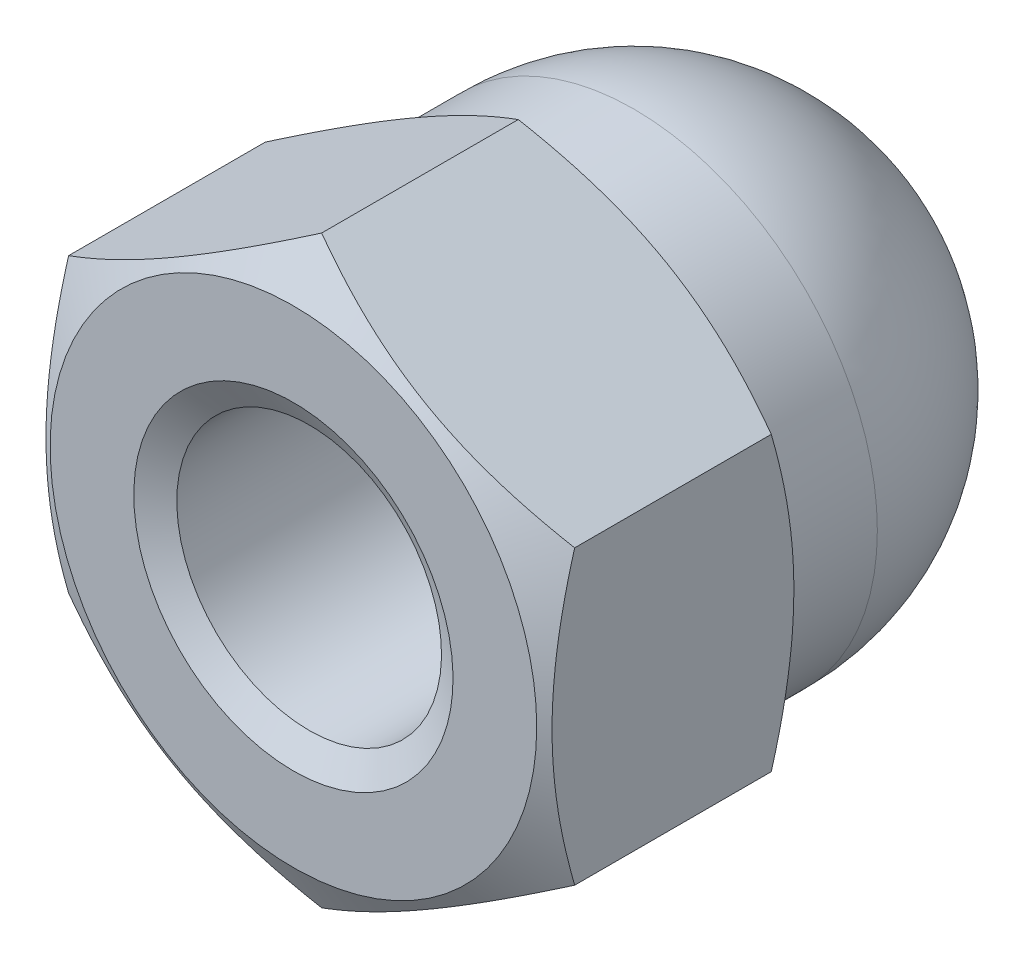
ISO-10303-21;
HEADER;
FILE_DESCRIPTION(('STEP AP214'),'2;1');
FILE_NAME('part.step','',(''),(''),'','','');
FILE_SCHEMA(('AUTOMOTIVE_DESIGN { 1 0 10303 214 1 1 1 1 }'));
ENDSEC;
DATA;
#1=APPLICATION_CONTEXT('core data for automotive mechanical design processes');
#2=APPLICATION_PROTOCOL_DEFINITION('international standard','automotive_design',2000,#1);
#3=PRODUCT_CONTEXT('',#1,'mechanical');
#4=PRODUCT('Part','Part','',(#3));
#5=PRODUCT_RELATED_PRODUCT_CATEGORY('part','',(#4));
#6=PRODUCT_DEFINITION_FORMATION('','',#4);
#7=PRODUCT_DEFINITION_CONTEXT('part definition',#1,'design');
#8=PRODUCT_DEFINITION('design','',#6,#7);
#9=PRODUCT_DEFINITION_SHAPE('','',#8);
#10=(LENGTH_UNIT() NAMED_UNIT(*) SI_UNIT(.MILLI.,.METRE.));
#11=(NAMED_UNIT(*) PLANE_ANGLE_UNIT() SI_UNIT($,.RADIAN.));
#12=(NAMED_UNIT(*) SI_UNIT($,.STERADIAN.) SOLID_ANGLE_UNIT());
#13=UNCERTAINTY_MEASURE_WITH_UNIT(LENGTH_MEASURE(1.E-05),#10,'distance_accuracy_value','');
#14=(GEOMETRIC_REPRESENTATION_CONTEXT(3) GLOBAL_UNCERTAINTY_ASSIGNED_CONTEXT((#13)) GLOBAL_UNIT_ASSIGNED_CONTEXT((#10,
#11,#12)) REPRESENTATION_CONTEXT('',''));
#15=CARTESIAN_POINT('',(0.,0.,0.));
#16=DIRECTION('',(0.,0.,1.));
#17=DIRECTION('',(1.,0.,0.));
#18=AXIS2_PLACEMENT_3D('',#15,#16,#17);
#19=CARTESIAN_POINT('',(0.,0.,-8.75));
#20=DIRECTION('',(0.,0.,1.));
#21=DIRECTION('',(0.,1.,0.));
#22=AXIS2_PLACEMENT_3D('',#19,#20,#21);
#23=SPHERICAL_SURFACE('',#22,6.25);
#24=CARTESIAN_POINT('',(0.,0.,-15.));
#25=VERTEX_POINT('',#24);
#26=VERTEX_LOOP('',#25);
#27=FACE_BOUND('',#26,.T.);
#28=CARTESIAN_POINT('',(0.,0.,-8.75));
#29=DIRECTION('',(0.,0.,1.));
#30=DIRECTION('',(1.,0.,0.));
#31=AXIS2_PLACEMENT_3D('',#28,#29,#30);
#32=CIRCLE('',#31,6.25);
#33=CARTESIAN_POINT('',(6.25,0.,-8.75));
#34=VERTEX_POINT('',#33);
#35=EDGE_CURVE('E250',#34,#34,#32,.T.);
#36=ORIENTED_EDGE('',*,*,#35,.F.);
#37=EDGE_LOOP('',(#36));
#38=FACE_BOUND('',#37,.T.);
#39=ADVANCED_FACE('F40',(#27,#38),#23,.T.);
#40=CARTESIAN_POINT('',(0.,0.,0.));
#41=DIRECTION('',(0.,0.,1.));
#42=DIRECTION('',(1.,0.,0.));
#43=AXIS2_PLACEMENT_3D('',#40,#41,#42);
#44=CYLINDRICAL_SURFACE('',#43,6.25);
#45=ORIENTED_EDGE('',*,*,#35,.T.);
#46=EDGE_LOOP('',(#45));
#47=FACE_BOUND('',#46,.T.);
#48=CARTESIAN_POINT('',(0.,0.,-6.5));
#49=DIRECTION('',(0.,0.,1.));
#50=DIRECTION('',(1.,0.,0.));
#51=AXIS2_PLACEMENT_3D('',#48,#49,#50);
#52=CIRCLE('',#51,6.25);
#53=CARTESIAN_POINT('',(6.25,0.,-6.5));
#54=VERTEX_POINT('',#53);
#55=EDGE_CURVE('E257',#54,#54,#52,.T.);
#56=ORIENTED_EDGE('',*,*,#55,.F.);
#57=EDGE_LOOP('',(#56));
#58=FACE_BOUND('',#57,.T.);
#59=ADVANCED_FACE('F113',(#47,#58),#44,.T.);
#60=CARTESIAN_POINT('',(0.,0.,-5.77510584910183));
#61=DIRECTION('',(0.,0.,1.));
#62=DIRECTION('',(1.,0.,0.));
#63=AXIS2_PLACEMENT_3D('',#60,#61,#62);
#64=CONICAL_SURFACE('',#63,7.50555349946514,1.0471975511966);
#65=ORIENTED_EDGE('',*,*,#55,.T.);
#66=EDGE_LOOP('',(#65));
#67=FACE_BOUND('',#66,.T.);
#68=CARTESIAN_POINT('',(6.5,-9.9329111139939,-3.25490668212306));
#69=CARTESIAN_POINT('',(6.5,-9.64767955039306,-3.39266312218123));
#70=CARTESIAN_POINT('',(6.5,-9.3617713334094,-3.52904400270682));
#71=CARTESIAN_POINT('',(6.5,-8.78823564087501,-3.79826812963094));
#72=CARTESIAN_POINT('',(6.5,-8.50060787599526,-3.93111075893199));
#73=CARTESIAN_POINT('',(6.5,-7.92170346582779,-4.19317607593001));
#74=CARTESIAN_POINT('',(6.5,-7.63041534596978,-4.32237350815587));
#75=CARTESIAN_POINT('',(6.5,-7.04543753790205,-4.5751901267429));
#76=CARTESIAN_POINT('',(6.5,-6.75174797646854,-4.69880960535651));
#77=CARTESIAN_POINT('',(6.5,-6.15794764754984,-4.94041567436681));
#78=CARTESIAN_POINT('',(6.5,-5.85780209090144,-5.05831723211061));
#79=CARTESIAN_POINT('',(6.5,-5.25396342793668,-5.28483618655303));
#80=CARTESIAN_POINT('',(6.5,-4.95026993066041,-5.39345254890334));
#81=CARTESIAN_POINT('',(6.5,-4.33948377050501,-5.59846829958748));
#82=CARTESIAN_POINT('',(6.5,-4.03239997429356,-5.69489383758256));
#83=CARTESIAN_POINT('',(6.5,-3.41386453476732,-5.87238231884677));
#84=CARTESIAN_POINT('',(6.5,-3.10241431094498,-5.95345013587121));
#85=CARTESIAN_POINT('',(6.5,-2.47494029352131,-6.09628094206173));
#86=CARTESIAN_POINT('',(6.5,-2.15891506480611,-6.15803773005165));
#87=CARTESIAN_POINT('',(6.5,-1.52303274646518,-6.25805563902524));
#88=CARTESIAN_POINT('',(6.5,-1.20317564973265,-6.29631671642553));
#89=CARTESIAN_POINT('',(6.5,-0.722892860804675,-6.33363342159267));
#90=CARTESIAN_POINT('',(6.5,-0.563206443347277,-6.34272902235531));
#91=CARTESIAN_POINT('',(6.5,-0.243584804318439,-6.35415572292365));
#92=CARTESIAN_POINT('',(6.5,-0.0836495865185552,-6.35648692428988));
#93=CARTESIAN_POINT('',(6.5,0.236128769735205,-6.35432167663095));
#94=CARTESIAN_POINT('',(6.5,0.39597192142786,-6.34982712805691));
#95=CARTESIAN_POINT('',(6.5,0.715330785773326,-6.33412365838045));
#96=CARTESIAN_POINT('',(6.5,0.874846480355594,-6.32291437622014));
#97=CARTESIAN_POINT('',(6.5,1.26198993509599,-6.28779328680309));
#98=CARTESIAN_POINT('',(6.5,1.48931571071904,-6.26048778077121));
#99=CARTESIAN_POINT('',(6.5,1.94217299466153,-6.19376399429842));
#100=CARTESIAN_POINT('',(6.5,2.16770422901663,-6.15434389944442));
#101=CARTESIAN_POINT('',(6.5,2.84200611808104,-6.01989020814481));
#102=CARTESIAN_POINT('',(6.5,3.28760230765344,-5.9087534364401));
#103=CARTESIAN_POINT('',(6.5,3.95410051775721,-5.71728873517789));
#104=CARTESIAN_POINT('',(6.5,4.17848908923233,-5.64841043008936));
#105=CARTESIAN_POINT('',(6.5,4.62509856435044,-5.50382682081051));
#106=CARTESIAN_POINT('',(6.5,4.84731927125518,-5.42812090327103));
#107=CARTESIAN_POINT('',(6.5,5.28848357156532,-5.27150122140702));
#108=CARTESIAN_POINT('',(6.5,5.5074385880228,-5.1906193076524));
#109=CARTESIAN_POINT('',(6.5,5.94348794783134,-5.02419729743006));
#110=CARTESIAN_POINT('',(6.5,6.16058290820352,-4.93865882083369));
#111=CARTESIAN_POINT('',(6.5,6.37689512702086,-4.85122853225757));
#112=B_SPLINE_CURVE_WITH_KNOTS('',3,(#68,#69,#70,#71,#72,#73,#74,#75,#76,#77,#78,#79,#80,#81,
#82,#83,#84,#85,#86,#87,#88,#89,#90,#91,#92,#93,#94,#95,#96,#97,#98,#99,#100,#101,#102,#103,
#104,#105,#106,#107,#108,#109,#110,#111),.UNSPECIFIED.,.F.,.F.,(4,2,2,2,2,2,2,2,2,2,2,2,2,2,2,2,
2,2,2,2,2,4),(0.,0.950278588424249,1.90072184145585,2.8566391323511,3.81250628042664,
4.77980343869427,5.74720821148916,6.71250133597995,7.67748761074125,8.64278344534725,
9.60808107052473,10.0877950648644,10.5675018567522,11.0470751113439,11.5266741553803,
12.2131633142698,12.8997553394188,14.2755893174374,14.9797013551423,15.6838767089079,
16.3840723670879,17.0840259867149),.UNSPECIFIED.);
#113=CARTESIAN_POINT('',(6.5,-3.75277674973257,-5.77510584910183));
#114=VERTEX_POINT('',#113);
#115=CARTESIAN_POINT('',(6.5,3.75277674973257,-5.77510584910183));
#116=VERTEX_POINT('',#115);
#117=EDGE_CURVE('E140',#114,#116,#112,.T.);
#118=ORIENTED_EDGE('',*,*,#117,.F.);
#119=CARTESIAN_POINT('',(-0.000200000000002426,-7.50566896951897,-5.77503918089673));
#120=CARTESIAN_POINT('',(0.142677459058878,-7.4231786300702,-5.82265800962711));
#121=CARTESIAN_POINT('',(0.28608763453491,-7.34038072665458,-5.86811573209989));
#122=CARTESIAN_POINT('',(0.574072631317192,-7.17411251123976,-5.95411375067955));
#123=CARTESIAN_POINT('',(0.718647926571261,-7.09064192560665,-5.99465192547457));
#124=CARTESIAN_POINT('',(1.15468865052003,-6.83889369625719,-6.10809143157939));
#125=CARTESIAN_POINT('',(1.44787528284632,-6.66962231516081,-6.17261462557386));
#126=CARTESIAN_POINT('',(1.88662374554437,-6.41631077211555,-6.2482758491551));
#127=CARTESIAN_POINT('',(2.03087463649469,-6.33302748139454,-6.26982957624561));
#128=CARTESIAN_POINT('',(2.32002821713809,-6.16608458377293,-6.30597211809647));
#129=CARTESIAN_POINT('',(2.46493084809889,-6.08242501078143,-6.32056154824293));
#130=CARTESIAN_POINT('',(2.75498777942832,-5.91496056339806,-6.34240368019525));
#131=CARTESIAN_POINT('',(2.90014160605421,-5.8311559625217,-6.34966470838049));
#132=CARTESIAN_POINT('',(3.19057533697495,-5.66347396979287,-6.35670213012036));
#133=CARTESIAN_POINT('',(3.33585523723635,-5.5795965802691,-6.35647875489039));
#134=CARTESIAN_POINT('',(3.73387594242649,-5.34979921898453,-6.34557897418743));
#135=CARTESIAN_POINT('',(3.98648646102757,-5.20395446807007,-6.32728061483318));
#136=CARTESIAN_POINT('',(4.49002967823568,-4.91323365606636,-6.26925609124492));
#137=CARTESIAN_POINT('',(4.74096060593308,-4.76835861741226,-6.22951009416435));
#138=CARTESIAN_POINT('',(5.24551722064432,-4.47705272008732,-6.13015652950044));
#139=CARTESIAN_POINT('',(5.49907924143591,-4.33065861912703,-6.07012800706457));
#140=CARTESIAN_POINT('',(6.00242193575904,-4.04005357906494,-5.93388744019273));
#141=CARTESIAN_POINT('',(6.25220905555296,-3.89583891821182,-5.857707398539));
#142=CARTESIAN_POINT('',(6.5002,-3.75266127967873,-5.77503918089673));
#143=B_SPLINE_CURVE_WITH_KNOTS('',3,(#119,#120,#121,#122,#123,#124,#125,#126,#127,#128,#129,
#130,#131,#132,#133,#134,#135,#136,#137,#138,#139,#140,#141,#142),.UNSPECIFIED.,.F.,.F.,(4,2,2,
2,2,2,2,2,2,2,2,4),(0.,0.515105052395587,1.03043143507524,2.06322554824262,2.56697389547996,
3.07067772176454,3.57380860368928,4.0769239424252,4.9527935470566,5.82947446853466,
6.72559912449736,7.61996451221046),.UNSPECIFIED.);
#144=CARTESIAN_POINT('',(0.,-7.50555349946514,-5.77510584910183));
#145=VERTEX_POINT('',#144);
#146=EDGE_CURVE('E211',#145,#114,#143,.T.);
#147=ORIENTED_EDGE('',*,*,#146,.F.);
#148=CARTESIAN_POINT('',(-6.5002,-3.75266127967873,-5.77503918089673));
#149=CARTESIAN_POINT('',(-6.35732254094112,-3.8351516191275,-5.82265800962711));
#150=CARTESIAN_POINT('',(-6.21391236546509,-3.91794952254312,-5.86811573209989));
#151=CARTESIAN_POINT('',(-5.9259273686828,-4.08421773795795,-5.95411375067955));
#152=CARTESIAN_POINT('',(-5.78135207342874,-4.16768832359105,-5.99465192547457));
#153=CARTESIAN_POINT('',(-5.34531134947997,-4.41943655294051,-6.10809143157939));
#154=CARTESIAN_POINT('',(-5.05212471715368,-4.58870793403689,-6.17261462557385));
#155=CARTESIAN_POINT('',(-4.61337625445563,-4.84201947708215,-6.2482758491551));
#156=CARTESIAN_POINT('',(-4.46912536350531,-4.92530276780316,-6.26982957624561));
#157=CARTESIAN_POINT('',(-4.17997178286191,-5.09224566542477,-6.30597211809647));
#158=CARTESIAN_POINT('',(-4.03506915190111,-5.17590523841627,-6.32056154824293));
#159=CARTESIAN_POINT('',(-3.74501222057168,-5.34336968579964,-6.34240368019525));
#160=CARTESIAN_POINT('',(-3.59985839394579,-5.427174286676,-6.34966470838048));
#161=CARTESIAN_POINT('',(-3.30942466302505,-5.59485627940484,-6.35670213012036));
#162=CARTESIAN_POINT('',(-3.16414476276364,-5.6787336689286,-6.35647875489039));
#163=CARTESIAN_POINT('',(-2.76612405757351,-5.90853103021317,-6.34557897418743));
#164=CARTESIAN_POINT('',(-2.51351353897243,-6.05437578112763,-6.32728061483318));
#165=CARTESIAN_POINT('',(-2.00997032176432,-6.34509659313135,-6.26925609124492));
#166=CARTESIAN_POINT('',(-1.75903939406692,-6.48997163178544,-6.22951009416435));
#167=CARTESIAN_POINT('',(-1.25448277935568,-6.78127752911038,-6.13015652950044));
#168=CARTESIAN_POINT('',(-1.00092075856409,-6.92767163007067,-6.07012800706457));
#169=CARTESIAN_POINT('',(-0.497578064240958,-7.21827667013277,-5.93388744019273));
#170=CARTESIAN_POINT('',(-0.247790944447039,-7.36249133098589,-5.857707398539));
#171=CARTESIAN_POINT('',(0.000199999999996356,-7.50566896951897,-5.77503918089673));
#172=B_SPLINE_CURVE_WITH_KNOTS('',3,(#148,#149,#150,#151,#152,#153,#154,#155,#156,#157,#158,
#159,#160,#161,#162,#163,#164,#165,#166,#167,#168,#169,#170,#171),.UNSPECIFIED.,.F.,.F.,(4,2,2,
2,2,2,2,2,2,2,2,4),(0.,0.515105052395587,1.03043143507524,2.06322554824262,2.56697389547996,
3.07067772176453,3.57380860368928,4.0769239424252,4.9527935470566,5.82947446853466,
6.72559912449736,7.61996451221045),.UNSPECIFIED.);
#173=CARTESIAN_POINT('',(-6.5,-3.75277674973257,-5.77510584910183));
#174=VERTEX_POINT('',#173);
#175=EDGE_CURVE('E204',#174,#145,#172,.T.);
#176=ORIENTED_EDGE('',*,*,#175,.F.);
#177=CARTESIAN_POINT('',(-6.5,-9.9329111139939,-3.25490668212307));
#178=CARTESIAN_POINT('',(-6.5,-9.64767955039306,-3.39266312218123));
#179=CARTESIAN_POINT('',(-6.5,-9.3617713334094,-3.52904400270682));
#180=CARTESIAN_POINT('',(-6.5,-8.78823564087501,-3.79826812963094));
#181=CARTESIAN_POINT('',(-6.5,-8.50060787599526,-3.93111075893199));
#182=CARTESIAN_POINT('',(-6.5,-7.92170346582779,-4.19317607593001));
#183=CARTESIAN_POINT('',(-6.5,-7.63041534596978,-4.32237350815587));
#184=CARTESIAN_POINT('',(-6.5,-7.04543753790205,-4.5751901267429));
#185=CARTESIAN_POINT('',(-6.5,-6.75174797646855,-4.69880960535651));
#186=CARTESIAN_POINT('',(-6.5,-6.15794764754984,-4.94041567436681));
#187=CARTESIAN_POINT('',(-6.5,-5.85780209090144,-5.05831723211062));
#188=CARTESIAN_POINT('',(-6.5,-5.25396342793668,-5.28483618655303));
#189=CARTESIAN_POINT('',(-6.5,-4.95026993066041,-5.39345254890334));
#190=CARTESIAN_POINT('',(-6.5,-4.33948377050501,-5.59846829958748));
#191=CARTESIAN_POINT('',(-6.5,-4.03239997429356,-5.69489383758256));
#192=CARTESIAN_POINT('',(-6.5,-3.41386453476732,-5.87238231884678));
#193=CARTESIAN_POINT('',(-6.5,-3.10241431094498,-5.95345013587121));
#194=CARTESIAN_POINT('',(-6.5,-2.47494029352131,-6.09628094206174));
#195=CARTESIAN_POINT('',(-6.5,-2.1589150648061,-6.15803773005165));
#196=CARTESIAN_POINT('',(-6.5,-1.52303274646518,-6.25805563902524));
#197=CARTESIAN_POINT('',(-6.5,-1.20317564973265,-6.29631671642553));
#198=CARTESIAN_POINT('',(-6.5,-0.722892860804673,-6.33363342159267));
#199=CARTESIAN_POINT('',(-6.5,-0.563206443347274,-6.34272902235531));
#200=CARTESIAN_POINT('',(-6.5,-0.243584804318436,-6.35415572292365));
#201=CARTESIAN_POINT('',(-6.5,-0.0836495865185526,-6.35648692428988));
#202=CARTESIAN_POINT('',(-6.5,0.236128769735207,-6.35432167663095));
#203=CARTESIAN_POINT('',(-6.5,0.395971921427861,-6.34982712805691));
#204=CARTESIAN_POINT('',(-6.5,0.715330785773325,-6.33412365838045));
#205=CARTESIAN_POINT('',(-6.5,0.874846480355593,-6.32291437622014));
#206=CARTESIAN_POINT('',(-6.5,1.26198993509598,-6.28779328680309));
#207=CARTESIAN_POINT('',(-6.5,1.48931571071904,-6.26048778077121));
#208=CARTESIAN_POINT('',(-6.5,1.94217299466152,-6.19376399429842));
#209=CARTESIAN_POINT('',(-6.5,2.16770422901663,-6.15434389944442));
#210=CARTESIAN_POINT('',(-6.5,2.84200611808104,-6.01989020814481));
#211=CARTESIAN_POINT('',(-6.5,3.28760230765344,-5.90875343644009));
#212=CARTESIAN_POINT('',(-6.5,3.95410051775721,-5.71728873517789));
#213=CARTESIAN_POINT('',(-6.5,4.17848908923233,-5.64841043008936));
#214=CARTESIAN_POINT('',(-6.5,4.62509856435044,-5.50382682081051));
#215=CARTESIAN_POINT('',(-6.5,4.84731927125518,-5.42812090327103));
#216=CARTESIAN_POINT('',(-6.5,5.28848357156532,-5.27150122140702));
#217=CARTESIAN_POINT('',(-6.5,5.5074385880228,-5.1906193076524));
#218=CARTESIAN_POINT('',(-6.5,5.94348794783134,-5.02419729743006));
#219=CARTESIAN_POINT('',(-6.5,6.16058290820352,-4.93865882083369));
#220=CARTESIAN_POINT('',(-6.5,6.37689512702086,-4.85122853225757));
#221=B_SPLINE_CURVE_WITH_KNOTS('',3,(#177,#178,#179,#180,#181,#182,#183,#184,#185,#186,#187,
#188,#189,#190,#191,#192,#193,#194,#195,#196,#197,#198,#199,#200,#201,#202,#203,#204,#205,#206,
#207,#208,#209,#210,#211,#212,#213,#214,#215,#216,#217,#218,#219,#220),.UNSPECIFIED.,.F.,.F.,(4,
2,2,2,2,2,2,2,2,2,2,2,2,2,2,2,2,2,2,2,2,4),(0.,0.950278588424246,1.90072184145585,
2.8566391323511,3.81250628042663,4.77980343869427,5.74720821148915,6.71250133597995,
7.67748761074125,8.64278344534725,9.60808107052473,10.0877950648644,10.5675018567522,
11.0470751113439,11.5266741553803,12.2131633142698,12.8997553394188,14.2755893174374,
14.9797013551423,15.6838767089079,16.3840723670879,17.0840259867149),.UNSPECIFIED.);
#222=CARTESIAN_POINT('',(-6.5,3.75277674973257,-5.77510584910183));
#223=VERTEX_POINT('',#222);
#224=EDGE_CURVE('E58',#223,#174,#221,.F.);
#225=ORIENTED_EDGE('',*,*,#224,.F.);
#226=CARTESIAN_POINT('',(0.000199999999999833,7.50566896951897,-5.77503918089673));
#227=CARTESIAN_POINT('',(-0.142677459058881,7.4231786300702,-5.82265800962711));
#228=CARTESIAN_POINT('',(-0.286087634534913,7.34038072665458,-5.86811573209989));
#229=CARTESIAN_POINT('',(-0.574072631317194,7.17411251123976,-5.95411375067955));
#230=CARTESIAN_POINT('',(-0.718647926571263,7.09064192560665,-5.99465192547457));
#231=CARTESIAN_POINT('',(-1.15468865052003,6.83889369625719,-6.10809143157939));
#232=CARTESIAN_POINT('',(-1.44787528284632,6.66962231516081,-6.17261462557385));
#233=CARTESIAN_POINT('',(-1.88662374554437,6.41631077211555,-6.2482758491551));
#234=CARTESIAN_POINT('',(-2.03087463649469,6.33302748139454,-6.26982957624561));
#235=CARTESIAN_POINT('',(-2.32002821713809,6.16608458377293,-6.30597211809647));
#236=CARTESIAN_POINT('',(-2.46493084809889,6.08242501078143,-6.32056154824293));
#237=CARTESIAN_POINT('',(-2.75498777942832,5.91496056339807,-6.34240368019525));
#238=CARTESIAN_POINT('',(-2.90014160605421,5.8311559625217,-6.34966470838048));
#239=CARTESIAN_POINT('',(-3.19057533697495,5.66347396979287,-6.35670213012036));
#240=CARTESIAN_POINT('',(-3.33585523723636,5.5795965802691,-6.35647875489039));
#241=CARTESIAN_POINT('',(-3.73387594242649,5.34979921898453,-6.34557897418743));
#242=CARTESIAN_POINT('',(-3.98648646102757,5.20395446807007,-6.32728061483318));
#243=CARTESIAN_POINT('',(-4.49002967823568,4.91323365606636,-6.26925609124492));
#244=CARTESIAN_POINT('',(-4.74096060593308,4.76835861741226,-6.22951009416435));
#245=CARTESIAN_POINT('',(-5.24551722064432,4.47705272008732,-6.13015652950044));
#246=CARTESIAN_POINT('',(-5.49907924143591,4.33065861912703,-6.07012800706457));
#247=CARTESIAN_POINT('',(-6.00242193575904,4.04005357906494,-5.93388744019273));
#248=CARTESIAN_POINT('',(-6.25220905555296,3.89583891821182,-5.857707398539));
#249=CARTESIAN_POINT('',(-6.5002,3.75266127967873,-5.77503918089673));
#250=B_SPLINE_CURVE_WITH_KNOTS('',3,(#226,#227,#228,#229,#230,#231,#232,#233,#234,#235,#236,
#237,#238,#239,#240,#241,#242,#243,#244,#245,#246,#247,#248,#249),.UNSPECIFIED.,.F.,.F.,(4,2,2,
2,2,2,2,2,2,2,2,4),(0.,0.515105052395587,1.03043143507524,2.06322554824262,2.56697389547996,
3.07067772176454,3.57380860368928,4.0769239424252,4.9527935470566,5.82947446853466,
6.72559912449736,7.61996451221045),.UNSPECIFIED.);
#251=CARTESIAN_POINT('',(0.,7.50555349946514,-5.77510584910183));
#252=VERTEX_POINT('',#251);
#253=EDGE_CURVE('E247',#252,#223,#250,.T.);
#254=ORIENTED_EDGE('',*,*,#253,.F.);
#255=CARTESIAN_POINT('',(6.5002,3.75266127967873,-5.77503918089673));
#256=CARTESIAN_POINT('',(6.35732254094112,3.83515161912751,-5.82265800962711));
#257=CARTESIAN_POINT('',(6.21391236546508,3.91794952254312,-5.86811573209989));
#258=CARTESIAN_POINT('',(5.9259273686828,4.08421773795795,-5.95411375067955));
#259=CARTESIAN_POINT('',(5.78135207342873,4.16768832359106,-5.99465192547457));
#260=CARTESIAN_POINT('',(5.34531134947996,4.41943655294052,-6.10809143157939));
#261=CARTESIAN_POINT('',(5.05212471715368,4.5887079340369,-6.17261462557385));
#262=CARTESIAN_POINT('',(4.61337625445562,4.84201947708215,-6.2482758491551));
#263=CARTESIAN_POINT('',(4.46912536350531,4.92530276780316,-6.26982957624561));
#264=CARTESIAN_POINT('',(4.17997178286191,5.09224566542477,-6.30597211809647));
#265=CARTESIAN_POINT('',(4.03506915190111,5.17590523841628,-6.32056154824293));
#266=CARTESIAN_POINT('',(3.74501222057168,5.34336968579964,-6.34240368019525));
#267=CARTESIAN_POINT('',(3.59985839394579,5.427174286676,-6.34966470838048));
#268=CARTESIAN_POINT('',(3.30942466302505,5.59485627940484,-6.35670213012036));
#269=CARTESIAN_POINT('',(3.16414476276364,5.6787336689286,-6.35647875489039));
#270=CARTESIAN_POINT('',(2.7661240575735,5.90853103021317,-6.34557897418743));
#271=CARTESIAN_POINT('',(2.51351353897243,6.05437578112763,-6.32728061483318));
#272=CARTESIAN_POINT('',(2.00997032176432,6.34509659313135,-6.26925609124492));
#273=CARTESIAN_POINT('',(1.75903939406692,6.48997163178545,-6.22951009416435));
#274=CARTESIAN_POINT('',(1.25448277935568,6.78127752911039,-6.13015652950044));
#275=CARTESIAN_POINT('',(1.00092075856408,6.92767163007068,-6.07012800706457));
#276=CARTESIAN_POINT('',(0.497578064240954,7.21827667013277,-5.93388744019273));
#277=CARTESIAN_POINT('',(0.247790944447035,7.36249133098589,-5.857707398539));
#278=CARTESIAN_POINT('',(-0.000200000000000841,7.50566896951897,-5.77503918089673));
#279=B_SPLINE_CURVE_WITH_KNOTS('',3,(#255,#256,#257,#258,#259,#260,#261,#262,#263,#264,#265,
#266,#267,#268,#269,#270,#271,#272,#273,#274,#275,#276,#277,#278),.UNSPECIFIED.,.F.,.F.,(4,2,2,
2,2,2,2,2,2,2,2,4),(0.,0.515105052395587,1.03043143507524,2.06322554824262,2.56697389547996,
3.07067772176453,3.57380860368928,4.0769239424252,4.9527935470566,5.82947446853466,
6.72559912449736,7.61996451221045),.UNSPECIFIED.);
#280=EDGE_CURVE('E227',#116,#252,#279,.T.);
#281=ORIENTED_EDGE('',*,*,#280,.F.);
#282=EDGE_LOOP('',(#118,#147,#176,#225,#254,#281));
#283=FACE_BOUND('',#282,.T.);
#284=ADVANCED_FACE('F119',(#67,#283),#64,.T.);
#285=CARTESIAN_POINT('',(0.,7.50555349946514,-15.));
#286=DIRECTION('',(-0.5,0.866025403784439,0.));
#287=DIRECTION('',(-0.866025403784439,-0.5,0.));
#288=AXIS2_PLACEMENT_3D('',#285,#286,#287);
#289=PLANE('',#288);
#290=DIRECTION('',(0.,0.,1.));
#291=VECTOR('',#290,1.);
#292=CARTESIAN_POINT('',(0.,7.50555349946514,-15.));
#293=LINE('',#292,#291);
#294=CARTESIAN_POINT('',(0.,7.50555349946514,-0.724894150898164));
#295=VERTEX_POINT('',#294);
#296=EDGE_CURVE('E45',#252,#295,#293,.T.);
#297=ORIENTED_EDGE('',*,*,#296,.F.);
#298=ORIENTED_EDGE('',*,*,#253,.T.);
#299=DIRECTION('',(0.,0.,1.));
#300=VECTOR('',#299,1.);
#301=CARTESIAN_POINT('',(-6.5,3.75277674973257,-15.));
#302=LINE('',#301,#300);
#303=CARTESIAN_POINT('',(-6.5,3.75277674973257,-0.724894150898164));
#304=VERTEX_POINT('',#303);
#305=EDGE_CURVE('E243',#223,#304,#302,.T.);
#306=ORIENTED_EDGE('',*,*,#305,.T.);
#307=CARTESIAN_POINT('',(-6.5002,3.75266127967873,-0.724960819103268));
#308=CARTESIAN_POINT('',(-6.35732254094112,3.83515161912751,-0.677341990372886));
#309=CARTESIAN_POINT('',(-6.21391236546509,3.91794952254312,-0.631884267900107));
#310=CARTESIAN_POINT('',(-5.9259273686828,4.08421773795795,-0.545886249320447));
#311=CARTESIAN_POINT('',(-5.78135207342873,4.16768832359106,-0.505348074525427));
#312=CARTESIAN_POINT('',(-5.34531134947996,4.41943655294052,-0.391908568420611));
#313=CARTESIAN_POINT('',(-5.05212471715368,4.5887079340369,-0.327385374426142));
#314=CARTESIAN_POINT('',(-4.61337625445563,4.84201947708215,-0.251724150844896));
#315=CARTESIAN_POINT('',(-4.46912536350531,4.92530276780316,-0.230170423754392));
#316=CARTESIAN_POINT('',(-4.17997178286191,5.09224566542477,-0.194027881903524));
#317=CARTESIAN_POINT('',(-4.03506915190111,5.17590523841627,-0.179438451757072));
#318=CARTESIAN_POINT('',(-3.74501222057168,5.34336968579964,-0.157596319804752));
#319=CARTESIAN_POINT('',(-3.59985839394579,5.427174286676,-0.150335291619513));
#320=CARTESIAN_POINT('',(-3.30942466302505,5.59485627940484,-0.143297869879637));
#321=CARTESIAN_POINT('',(-3.16414476276364,5.6787336689286,-0.14352124510961));
#322=CARTESIAN_POINT('',(-2.76612405757351,5.90853103021317,-0.15442102581257));
#323=CARTESIAN_POINT('',(-2.51351353897243,6.05437578112763,-0.172719385166818));
#324=CARTESIAN_POINT('',(-2.00997032176432,6.34509659313135,-0.23074390875508));
#325=CARTESIAN_POINT('',(-1.75903939406692,6.48997163178545,-0.270489905835649));
#326=CARTESIAN_POINT('',(-1.25448277935568,6.78127752911039,-0.369843470499553));
#327=CARTESIAN_POINT('',(-1.00092075856409,6.92767163007068,-0.42987199293543));
#328=CARTESIAN_POINT('',(-0.497578064240955,7.21827667013277,-0.56611255980727));
#329=CARTESIAN_POINT('',(-0.247790944447036,7.36249133098589,-0.642292601460994));
#330=CARTESIAN_POINT('',(0.000200000000000163,7.50566896951897,-0.724960819103268));
#331=B_SPLINE_CURVE_WITH_KNOTS('',3,(#307,#308,#309,#310,#311,#312,#313,#314,#315,#316,#317,
#318,#319,#320,#321,#322,#323,#324,#325,#326,#327,#328,#329,#330),.UNSPECIFIED.,.F.,.F.,(4,2,2,
2,2,2,2,2,2,2,2,4),(0.,0.515105052395588,1.03043143507524,2.06322554824262,2.56697389547996,
3.07067772176453,3.57380860368927,4.0769239424252,4.9527935470566,5.82947446853466,
6.72559912449736,7.61996451221045),.UNSPECIFIED.);
#332=EDGE_CURVE('E175',#304,#295,#331,.T.);
#333=ORIENTED_EDGE('',*,*,#332,.T.);
#334=EDGE_LOOP('',(#297,#298,#306,#333));
#335=FACE_BOUND('',#334,.T.);
#336=ADVANCED_FACE('F246',(#335),#289,.T.);
#337=CARTESIAN_POINT('',(-6.5,3.75277674973257,-15.));
#338=DIRECTION('',(-1.,0.,0.));
#339=DIRECTION('',(0.,0.,1.));
#340=AXIS2_PLACEMENT_3D('',#337,#338,#339);
#341=PLANE('',#340);
#342=ORIENTED_EDGE('',*,*,#305,.F.);
#343=ORIENTED_EDGE('',*,*,#224,.T.);
#344=DIRECTION('',(0.,0.,1.));
#345=VECTOR('',#344,1.);
#346=CARTESIAN_POINT('',(-6.5,-3.75277674973257,-15.));
#347=LINE('',#346,#345);
#348=CARTESIAN_POINT('',(-6.5,-3.75277674973257,-0.724894150898164));
#349=VERTEX_POINT('',#348);
#350=EDGE_CURVE('E245',#174,#349,#347,.T.);
#351=ORIENTED_EDGE('',*,*,#350,.T.);
#352=CARTESIAN_POINT('',(-6.5,-9.9329111139939,-3.24509331787692));
#353=CARTESIAN_POINT('',(-6.5,-9.64767955039306,-3.10733687781875));
#354=CARTESIAN_POINT('',(-6.5,-9.3617713334094,-2.97095599729316));
#355=CARTESIAN_POINT('',(-6.5,-8.78823564087501,-2.70173187036905));
#356=CARTESIAN_POINT('',(-6.5,-8.50060787599526,-2.568889241068));
#357=CARTESIAN_POINT('',(-6.5,-7.92170346582779,-2.30682392406997));
#358=CARTESIAN_POINT('',(-6.5,-7.63041534596978,-2.17762649184412));
#359=CARTESIAN_POINT('',(-6.5,-7.04543753790205,-1.92480987325709));
#360=CARTESIAN_POINT('',(-6.5,-6.75174797646854,-1.80119039464348));
#361=CARTESIAN_POINT('',(-6.5,-6.15794764754984,-1.55958432563318));
#362=CARTESIAN_POINT('',(-6.5,-5.85780209090144,-1.44168276788938));
#363=CARTESIAN_POINT('',(-6.5,-5.25396342793668,-1.21516381344696));
#364=CARTESIAN_POINT('',(-6.5,-4.95026993066041,-1.10654745109665));
#365=CARTESIAN_POINT('',(-6.5,-4.33948377050501,-0.90153170041251));
#366=CARTESIAN_POINT('',(-6.5,-4.03239997429356,-0.805106162417432));
#367=CARTESIAN_POINT('',(-6.5,-3.41386453476732,-0.62761768115322));
#368=CARTESIAN_POINT('',(-6.5,-3.10241431094498,-0.546549864128785));
#369=CARTESIAN_POINT('',(-6.5,-2.47494029352131,-0.403719057938262));
#370=CARTESIAN_POINT('',(-6.5,-2.1589150648061,-0.34196226994835));
#371=CARTESIAN_POINT('',(-6.5,-1.52303274646518,-0.241944360974753));
#372=CARTESIAN_POINT('',(-6.5,-1.20317564973265,-0.203683283574471));
#373=CARTESIAN_POINT('',(-6.5,-0.722892860804675,-0.166366578407329));
#374=CARTESIAN_POINT('',(-6.5,-0.563206443347277,-0.157270977644687));
#375=CARTESIAN_POINT('',(-6.5,-0.24358480431844,-0.145844277076348));
#376=CARTESIAN_POINT('',(-6.5,-0.0836495865185563,-0.143513075710118));
#377=CARTESIAN_POINT('',(-6.5,0.236128769735203,-0.14567832336905));
#378=CARTESIAN_POINT('',(-6.5,0.395971921427857,-0.150172871943083));
#379=CARTESIAN_POINT('',(-6.5,0.715330785773322,-0.165876341619546));
#380=CARTESIAN_POINT('',(-6.5,0.874846480355589,-0.177085623779862));
#381=CARTESIAN_POINT('',(-6.5,1.26198993509598,-0.21220671319691));
#382=CARTESIAN_POINT('',(-6.5,1.48931571071904,-0.239512219228783));
#383=CARTESIAN_POINT('',(-6.5,1.94217299466153,-0.306236005701577));
#384=CARTESIAN_POINT('',(-6.5,2.16770422901663,-0.34565610055558));
#385=CARTESIAN_POINT('',(-6.5,2.84200611808104,-0.480109791855188));
#386=CARTESIAN_POINT('',(-6.5,3.28760230765345,-0.591246563559904));
#387=CARTESIAN_POINT('',(-6.5,3.95410051775722,-0.782711264822109));
#388=CARTESIAN_POINT('',(-6.5,4.17848908923234,-0.851589569910639));
#389=CARTESIAN_POINT('',(-6.5,4.62509856435045,-0.996173179189491));
#390=CARTESIAN_POINT('',(-6.5,4.8473192712552,-1.07187909672897));
#391=CARTESIAN_POINT('',(-6.5,5.28848357156534,-1.22849877859298));
#392=CARTESIAN_POINT('',(-6.5,5.50743858802282,-1.3093806923476));
#393=CARTESIAN_POINT('',(-6.5,5.94348794783136,-1.47580270256994));
#394=CARTESIAN_POINT('',(-6.5,6.16058290820355,-1.56134117916631));
#395=CARTESIAN_POINT('',(-6.5,6.37689512702088,-1.64877146774243));
#396=B_SPLINE_CURVE_WITH_KNOTS('',3,(#352,#353,#354,#355,#356,#357,#358,#359,#360,#361,#362,
#363,#364,#365,#366,#367,#368,#369,#370,#371,#372,#373,#374,#375,#376,#377,#378,#379,#380,#381,
#382,#383,#384,#385,#386,#387,#388,#389,#390,#391,#392,#393,#394,#395),.UNSPECIFIED.,.F.,.F.,(4,
2,2,2,2,2,2,2,2,2,2,2,2,2,2,2,2,2,2,2,2,4),(0.,0.950278588424245,1.90072184145585,
2.8566391323511,3.81250628042663,4.77980343869427,5.74720821148915,6.71250133597995,
7.67748761074124,8.64278344534724,9.60808107052472,10.0877950648643,10.5675018567521,
11.0470751113439,11.5266741553803,12.2131633142698,12.8997553394188,14.2755893174374,
14.9797013551423,15.6838767089079,16.3840723670879,17.0840259867149),.UNSPECIFIED.);
#397=EDGE_CURVE('E183',#349,#304,#396,.T.);
#398=ORIENTED_EDGE('',*,*,#397,.T.);
#399=EDGE_LOOP('',(#342,#343,#351,#398));
#400=FACE_BOUND('',#399,.T.);
#401=ADVANCED_FACE('F199',(#400),#341,.T.);
#402=CARTESIAN_POINT('',(-6.5,-3.75277674973257,-15.));
#403=DIRECTION('',(-0.5,-0.866025403784439,0.));
#404=DIRECTION('',(0.866025403784439,-0.5,0.));
#405=AXIS2_PLACEMENT_3D('',#402,#403,#404);
#406=PLANE('',#405);
#407=ORIENTED_EDGE('',*,*,#350,.F.);
#408=ORIENTED_EDGE('',*,*,#175,.T.);
#409=DIRECTION('',(0.,0.,1.));
#410=VECTOR('',#409,1.);
#411=CARTESIAN_POINT('',(0.,-7.50555349946513,-15.));
#412=LINE('',#411,#410);
#413=CARTESIAN_POINT('',(0.,-7.50555349946514,-0.724894150898164));
#414=VERTEX_POINT('',#413);
#415=EDGE_CURVE('E248',#145,#414,#412,.T.);
#416=ORIENTED_EDGE('',*,*,#415,.T.);
#417=CARTESIAN_POINT('',(0.000199999999997574,-7.50566896951897,-0.724960819103267));
#418=CARTESIAN_POINT('',(-0.142677459058883,-7.4231786300702,-0.677341990372886));
#419=CARTESIAN_POINT('',(-0.286087634534915,-7.34038072665458,-0.631884267900107));
#420=CARTESIAN_POINT('',(-0.574072631317197,-7.17411251123976,-0.545886249320447));
#421=CARTESIAN_POINT('',(-0.718647926571266,-7.09064192560665,-0.505348074525427));
#422=CARTESIAN_POINT('',(-1.15468865052003,-6.83889369625719,-0.391908568420611));
#423=CARTESIAN_POINT('',(-1.44787528284632,-6.66962231516081,-0.327385374426143));
#424=CARTESIAN_POINT('',(-1.88662374554437,-6.41631077211555,-0.251724150844895));
#425=CARTESIAN_POINT('',(-2.03087463649469,-6.33302748139454,-0.230170423754391));
#426=CARTESIAN_POINT('',(-2.32002821713809,-6.16608458377293,-0.194027881903523));
#427=CARTESIAN_POINT('',(-2.46493084809889,-6.08242501078143,-0.179438451757071));
#428=CARTESIAN_POINT('',(-2.75498777942832,-5.91496056339807,-0.157596319804752));
#429=CARTESIAN_POINT('',(-2.90014160605421,-5.8311559625217,-0.150335291619513));
#430=CARTESIAN_POINT('',(-3.19057533697495,-5.66347396979287,-0.143297869879636));
#431=CARTESIAN_POINT('',(-3.33585523723636,-5.5795965802691,-0.14352124510961));
#432=CARTESIAN_POINT('',(-3.73387594242649,-5.34979921898453,-0.154421025812571));
#433=CARTESIAN_POINT('',(-3.98648646102757,-5.20395446807007,-0.172719385166818));
#434=CARTESIAN_POINT('',(-4.49002967823568,-4.91323365606636,-0.230743908755079));
#435=CARTESIAN_POINT('',(-4.74096060593308,-4.76835861741226,-0.270489905835648));
#436=CARTESIAN_POINT('',(-5.24551722064432,-4.47705272008732,-0.369843470499552));
#437=CARTESIAN_POINT('',(-5.49907924143591,-4.33065861912703,-0.429871992935429));
#438=CARTESIAN_POINT('',(-6.00242193575904,-4.04005357906494,-0.566112559807269));
#439=CARTESIAN_POINT('',(-6.25220905555296,-3.89583891821182,-0.642292601460993));
#440=CARTESIAN_POINT('',(-6.5002,-3.75266127967873,-0.724960819103267));
#441=B_SPLINE_CURVE_WITH_KNOTS('',3,(#417,#418,#419,#420,#421,#422,#423,#424,#425,#426,#427,
#428,#429,#430,#431,#432,#433,#434,#435,#436,#437,#438,#439,#440),.UNSPECIFIED.,.F.,.F.,(4,2,2,
2,2,2,2,2,2,2,2,4),(0.,0.515105052395588,1.03043143507524,2.06322554824262,2.56697389547996,
3.07067772176453,3.57380860368927,4.0769239424252,4.9527935470566,5.82947446853466,
6.72559912449736,7.61996451221045),.UNSPECIFIED.);
#442=EDGE_CURVE('E190',#414,#349,#441,.T.);
#443=ORIENTED_EDGE('',*,*,#442,.T.);
#444=EDGE_LOOP('',(#407,#408,#416,#443));
#445=FACE_BOUND('',#444,.T.);
#446=ADVANCED_FACE('F196',(#445),#406,.T.);
#447=CARTESIAN_POINT('',(0.,-7.50555349946513,-15.));
#448=DIRECTION('',(0.5,-0.866025403784439,0.));
#449=DIRECTION('',(0.866025403784439,0.5,0.));
#450=AXIS2_PLACEMENT_3D('',#447,#448,#449);
#451=PLANE('',#450);
#452=ORIENTED_EDGE('',*,*,#415,.F.);
#453=ORIENTED_EDGE('',*,*,#146,.T.);
#454=DIRECTION('',(0.,0.,1.));
#455=VECTOR('',#454,1.);
#456=CARTESIAN_POINT('',(6.5,-3.75277674973257,-15.));
#457=LINE('',#456,#455);
#458=CARTESIAN_POINT('',(6.5,-3.75277674973257,-0.724894150898164));
#459=VERTEX_POINT('',#458);
#460=EDGE_CURVE('E50',#114,#459,#457,.T.);
#461=ORIENTED_EDGE('',*,*,#460,.T.);
#462=CARTESIAN_POINT('',(6.5002,-3.75266127967873,-0.724960819103268));
#463=CARTESIAN_POINT('',(6.35732254094112,-3.8351516191275,-0.677341990372886));
#464=CARTESIAN_POINT('',(6.21391236546509,-3.91794952254312,-0.631884267900107));
#465=CARTESIAN_POINT('',(5.92592736868281,-4.08421773795795,-0.545886249320448));
#466=CARTESIAN_POINT('',(5.78135207342874,-4.16768832359105,-0.505348074525428));
#467=CARTESIAN_POINT('',(5.34531134947997,-4.41943655294051,-0.391908568420612));
#468=CARTESIAN_POINT('',(5.05212471715368,-4.58870793403689,-0.327385374426142));
#469=CARTESIAN_POINT('',(4.61337625445563,-4.84201947708215,-0.251724150844895));
#470=CARTESIAN_POINT('',(4.46912536350531,-4.92530276780316,-0.230170423754392));
#471=CARTESIAN_POINT('',(4.17997178286191,-5.09224566542477,-0.194027881903523));
#472=CARTESIAN_POINT('',(4.03506915190111,-5.17590523841627,-0.179438451757071));
#473=CARTESIAN_POINT('',(3.74501222057168,-5.34336968579964,-0.157596319804751));
#474=CARTESIAN_POINT('',(3.59985839394579,-5.427174286676,-0.150335291619512));
#475=CARTESIAN_POINT('',(3.30942466302505,-5.59485627940483,-0.143297869879636));
#476=CARTESIAN_POINT('',(3.16414476276364,-5.6787336689286,-0.143521245109609));
#477=CARTESIAN_POINT('',(2.76612405757351,-5.90853103021317,-0.154421025812569));
#478=CARTESIAN_POINT('',(2.51351353897243,-6.05437578112763,-0.172719385166817));
#479=CARTESIAN_POINT('',(2.00997032176432,-6.34509659313134,-0.230743908755078));
#480=CARTESIAN_POINT('',(1.75903939406692,-6.48997163178544,-0.270489905835647));
#481=CARTESIAN_POINT('',(1.25448277935568,-6.78127752911038,-0.369843470499551));
#482=CARTESIAN_POINT('',(1.00092075856408,-6.92767163007067,-0.429871992935428));
#483=CARTESIAN_POINT('',(0.497578064240953,-7.21827667013277,-0.566112559807269));
#484=CARTESIAN_POINT('',(0.247790944447034,-7.36249133098589,-0.642292601460993));
#485=CARTESIAN_POINT('',(-0.000200000000002099,-7.50566896951897,-0.724960819103267));
#486=B_SPLINE_CURVE_WITH_KNOTS('',3,(#462,#463,#464,#465,#466,#467,#468,#469,#470,#471,#472,
#473,#474,#475,#476,#477,#478,#479,#480,#481,#482,#483,#484,#485),.UNSPECIFIED.,.F.,.F.,(4,2,2,
2,2,2,2,2,2,2,2,4),(0.,0.515105052395586,1.03043143507524,2.06322554824262,2.56697389547996,
3.07067772176453,3.57380860368927,4.07692394242519,4.9527935470566,5.82947446853466,
6.72559912449736,7.61996451221046),.UNSPECIFIED.);
#487=EDGE_CURVE('E157',#459,#414,#486,.T.);
#488=ORIENTED_EDGE('',*,*,#487,.T.);
#489=EDGE_LOOP('',(#452,#453,#461,#488));
#490=FACE_BOUND('',#489,.T.);
#491=ADVANCED_FACE('F134',(#490),#451,.T.);
#492=CARTESIAN_POINT('',(6.5,-3.75277674973257,-15.));
#493=DIRECTION('',(1.,0.,0.));
#494=DIRECTION('',(0.,1.,0.));
#495=AXIS2_PLACEMENT_3D('',#492,#493,#494);
#496=PLANE('',#495);
#497=ORIENTED_EDGE('',*,*,#460,.F.);
#498=ORIENTED_EDGE('',*,*,#117,.T.);
#499=DIRECTION('',(0.,0.,1.));
#500=VECTOR('',#499,1.);
#501=CARTESIAN_POINT('',(6.5,3.75277674973257,-15.));
#502=LINE('',#501,#500);
#503=CARTESIAN_POINT('',(6.5,3.75277674973257,-0.724894150898164));
#504=VERTEX_POINT('',#503);
#505=EDGE_CURVE('E11',#116,#504,#502,.T.);
#506=ORIENTED_EDGE('',*,*,#505,.T.);
#507=CARTESIAN_POINT('',(6.5,-9.9329111139939,-3.24509331787692));
#508=CARTESIAN_POINT('',(6.5,-9.64767955039306,-3.10733687781875));
#509=CARTESIAN_POINT('',(6.5,-9.3617713334094,-2.97095599729316));
#510=CARTESIAN_POINT('',(6.5,-8.78823564087501,-2.70173187036905));
#511=CARTESIAN_POINT('',(6.5,-8.50060787599526,-2.568889241068));
#512=CARTESIAN_POINT('',(6.5,-7.92170346582779,-2.30682392406997));
#513=CARTESIAN_POINT('',(6.5,-7.63041534596978,-2.17762649184412));
#514=CARTESIAN_POINT('',(6.5,-7.04543753790205,-1.92480987325709));
#515=CARTESIAN_POINT('',(6.5,-6.75174797646854,-1.80119039464347));
#516=CARTESIAN_POINT('',(6.5,-6.15794764754984,-1.55958432563318));
#517=CARTESIAN_POINT('',(6.5,-5.85780209090144,-1.44168276788937));
#518=CARTESIAN_POINT('',(6.5,-5.25396342793668,-1.21516381344696));
#519=CARTESIAN_POINT('',(6.5,-4.95026993066041,-1.10654745109665));
#520=CARTESIAN_POINT('',(6.5,-4.33948377050501,-0.901531700412509));
#521=CARTESIAN_POINT('',(6.5,-4.03239997429356,-0.805106162417432));
#522=CARTESIAN_POINT('',(6.5,-3.41386453476732,-0.627617681153221));
#523=CARTESIAN_POINT('',(6.5,-3.10241431094498,-0.546549864128785));
#524=CARTESIAN_POINT('',(6.5,-2.47494029352131,-0.403719057938261));
#525=CARTESIAN_POINT('',(6.5,-2.1589150648061,-0.34196226994835));
#526=CARTESIAN_POINT('',(6.5,-1.52303274646518,-0.241944360974753));
#527=CARTESIAN_POINT('',(6.5,-1.20317564973265,-0.20368328357447));
#528=CARTESIAN_POINT('',(6.5,-0.722892860804675,-0.166366578407329));
#529=CARTESIAN_POINT('',(6.5,-0.563206443347276,-0.157270977644687));
#530=CARTESIAN_POINT('',(6.5,-0.243584804318439,-0.145844277076348));
#531=CARTESIAN_POINT('',(6.5,-0.0836495865185555,-0.143513075710118));
#532=CARTESIAN_POINT('',(6.5,0.236128769735204,-0.14567832336905));
#533=CARTESIAN_POINT('',(6.5,0.395971921427859,-0.150172871943083));
#534=CARTESIAN_POINT('',(6.5,0.715330785773324,-0.165876341619545));
#535=CARTESIAN_POINT('',(6.5,0.87484648035559,-0.177085623779862));
#536=CARTESIAN_POINT('',(6.5,1.26198993509598,-0.21220671319691));
#537=CARTESIAN_POINT('',(6.5,1.48931571071904,-0.239512219228783));
#538=CARTESIAN_POINT('',(6.5,1.94217299466153,-0.306236005701576));
#539=CARTESIAN_POINT('',(6.5,2.16770422901664,-0.34565610055558));
#540=CARTESIAN_POINT('',(6.5,2.84200611808104,-0.480109791855188));
#541=CARTESIAN_POINT('',(6.5,3.28760230765345,-0.591246563559904));
#542=CARTESIAN_POINT('',(6.5,3.95410051775722,-0.782711264822109));
#543=CARTESIAN_POINT('',(6.5,4.17848908923234,-0.851589569910639));
#544=CARTESIAN_POINT('',(6.5,4.62509856435045,-0.996173179189491));
#545=CARTESIAN_POINT('',(6.5,4.8473192712552,-1.07187909672897));
#546=CARTESIAN_POINT('',(6.5,5.28848357156534,-1.22849877859298));
#547=CARTESIAN_POINT('',(6.5,5.50743858802282,-1.3093806923476));
#548=CARTESIAN_POINT('',(6.5,5.94348794783136,-1.47580270256994));
#549=CARTESIAN_POINT('',(6.5,6.16058290820355,-1.56134117916631));
#550=CARTESIAN_POINT('',(6.5,6.37689512702088,-1.64877146774243));
#551=B_SPLINE_CURVE_WITH_KNOTS('',3,(#507,#508,#509,#510,#511,#512,#513,#514,#515,#516,#517,
#518,#519,#520,#521,#522,#523,#524,#525,#526,#527,#528,#529,#530,#531,#532,#533,#534,#535,#536,
#537,#538,#539,#540,#541,#542,#543,#544,#545,#546,#547,#548,#549,#550),.UNSPECIFIED.,.F.,.F.,(4,
2,2,2,2,2,2,2,2,2,2,2,2,2,2,2,2,2,2,2,2,4),(0.,0.950278588424246,1.90072184145585,
2.8566391323511,3.81250628042664,4.77980343869427,5.74720821148915,6.71250133597995,
7.67748761074124,8.64278344534724,9.60808107052473,10.0877950648643,10.5675018567521,
11.0470751113439,11.5266741553803,12.2131633142698,12.8997553394188,14.2755893174374,
14.9797013551423,15.6838767089079,16.3840723670879,17.0840259867149),.UNSPECIFIED.);
#552=EDGE_CURVE('E149',#504,#459,#551,.F.);
#553=ORIENTED_EDGE('',*,*,#552,.T.);
#554=EDGE_LOOP('',(#497,#498,#506,#553));
#555=FACE_BOUND('',#554,.T.);
#556=ADVANCED_FACE('F130',(#555),#496,.T.);
#557=CARTESIAN_POINT('',(6.5,3.75277674973257,-15.));
#558=DIRECTION('',(0.5,0.866025403784439,0.));
#559=DIRECTION('',(-0.866025403784439,0.5,0.));
#560=AXIS2_PLACEMENT_3D('',#557,#558,#559);
#561=PLANE('',#560);
#562=ORIENTED_EDGE('',*,*,#505,.F.);
#563=ORIENTED_EDGE('',*,*,#280,.T.);
#564=ORIENTED_EDGE('',*,*,#296,.T.);
#565=CARTESIAN_POINT('',(-0.000200000000000195,7.50566896951897,-0.724960819103268));
#566=CARTESIAN_POINT('',(0.14267745905888,7.4231786300702,-0.677341990372887));
#567=CARTESIAN_POINT('',(0.286087634534912,7.34038072665458,-0.631884267900108));
#568=CARTESIAN_POINT('',(0.574072631317194,7.17411251123976,-0.545886249320448));
#569=CARTESIAN_POINT('',(0.718647926571263,7.09064192560665,-0.505348074525428));
#570=CARTESIAN_POINT('',(1.15468865052003,6.83889369625719,-0.391908568420611));
#571=CARTESIAN_POINT('',(1.44787528284632,6.66962231516081,-0.327385374426143));
#572=CARTESIAN_POINT('',(1.88662374554437,6.41631077211555,-0.251724150844896));
#573=CARTESIAN_POINT('',(2.03087463649469,6.33302748139454,-0.230170423754392));
#574=CARTESIAN_POINT('',(2.32002821713809,6.16608458377293,-0.194027881903524));
#575=CARTESIAN_POINT('',(2.46493084809889,6.08242501078143,-0.179438451757071));
#576=CARTESIAN_POINT('',(2.75498777942832,5.91496056339807,-0.157596319804751));
#577=CARTESIAN_POINT('',(2.90014160605421,5.8311559625217,-0.150335291619513));
#578=CARTESIAN_POINT('',(3.19057533697495,5.66347396979287,-0.143297869879636));
#579=CARTESIAN_POINT('',(3.33585523723636,5.5795965802691,-0.14352124510961));
#580=CARTESIAN_POINT('',(3.73387594242649,5.34979921898453,-0.15442102581257));
#581=CARTESIAN_POINT('',(3.98648646102757,5.20395446807007,-0.172719385166818));
#582=CARTESIAN_POINT('',(4.49002967823568,4.91323365606636,-0.230743908755079));
#583=CARTESIAN_POINT('',(4.74096060593308,4.76835861741226,-0.270489905835648));
#584=CARTESIAN_POINT('',(5.24551722064432,4.47705272008732,-0.369843470499552));
#585=CARTESIAN_POINT('',(5.49907924143591,4.33065861912703,-0.429871992935428));
#586=CARTESIAN_POINT('',(6.00242193575904,4.04005357906494,-0.566112559807269));
#587=CARTESIAN_POINT('',(6.25220905555296,3.89583891821182,-0.642292601460993));
#588=CARTESIAN_POINT('',(6.5002,3.75266127967873,-0.724960819103266));
#589=B_SPLINE_CURVE_WITH_KNOTS('',3,(#565,#566,#567,#568,#569,#570,#571,#572,#573,#574,#575,
#576,#577,#578,#579,#580,#581,#582,#583,#584,#585,#586,#587,#588),.UNSPECIFIED.,.F.,.F.,(4,2,2,
2,2,2,2,2,2,2,2,4),(0.,0.515105052395587,1.03043143507524,2.06322554824262,2.56697389547996,
3.07067772176453,3.57380860368927,4.0769239424252,4.9527935470566,5.82947446853466,
6.72559912449736,7.61996451221045),.UNSPECIFIED.);
#590=EDGE_CURVE('E66',#295,#504,#589,.T.);
#591=ORIENTED_EDGE('',*,*,#590,.T.);
#592=EDGE_LOOP('',(#562,#563,#564,#591));
#593=FACE_BOUND('',#592,.T.);
#594=ADVANCED_FACE('F42',(#593),#561,.T.);
#595=CARTESIAN_POINT('',(0.,0.,0.));
#596=DIRECTION('',(0.,0.,-1.));
#597=DIRECTION('',(-1.,0.,0.));
#598=AXIS2_PLACEMENT_3D('',#595,#596,#597);
#599=CONICAL_SURFACE('',#598,6.25,1.0471975511966);
#600=ORIENTED_EDGE('',*,*,#332,.F.);
#601=ORIENTED_EDGE('',*,*,#397,.F.);
#602=ORIENTED_EDGE('',*,*,#442,.F.);
#603=ORIENTED_EDGE('',*,*,#487,.F.);
#604=ORIENTED_EDGE('',*,*,#552,.F.);
#605=ORIENTED_EDGE('',*,*,#590,.F.);
#606=EDGE_LOOP('',(#600,#601,#602,#603,#604,#605));
#607=FACE_BOUND('',#606,.T.);
#608=CARTESIAN_POINT('',(0.,0.,0.));
#609=DIRECTION('',(0.,0.,1.));
#610=DIRECTION('',(1.,0.,0.));
#611=AXIS2_PLACEMENT_3D('',#608,#609,#610);
#612=CIRCLE('',#611,6.25);
#613=CARTESIAN_POINT('',(6.25,0.,0.));
#614=VERTEX_POINT('',#613);
#615=EDGE_CURVE('E259',#614,#614,#612,.T.);
#616=ORIENTED_EDGE('',*,*,#615,.F.);
#617=EDGE_LOOP('',(#616));
#618=FACE_BOUND('',#617,.T.);
#619=ADVANCED_FACE('F128',(#607,#618),#599,.T.);
#620=CARTESIAN_POINT('',(0.,0.,0.));
#621=DIRECTION('',(0.,0.,1.));
#622=DIRECTION('',(1.,0.,0.));
#623=AXIS2_PLACEMENT_3D('',#620,#621,#622);
#624=PLANE('',#623);
#625=CARTESIAN_POINT('',(0.,0.,0.));
#626=DIRECTION('',(0.,0.,1.));
#627=DIRECTION('',(0.,-1.,0.));
#628=AXIS2_PLACEMENT_3D('',#625,#626,#627);
#629=CIRCLE('',#628,4.1);
#630=CARTESIAN_POINT('',(0.,-4.1,0.));
#631=VERTEX_POINT('',#630);
#632=EDGE_CURVE('E367',#631,#631,#629,.T.);
#633=ORIENTED_EDGE('',*,*,#632,.F.);
#634=EDGE_LOOP('',(#633));
#635=FACE_BOUND('',#634,.T.);
#636=ORIENTED_EDGE('',*,*,#615,.T.);
#637=EDGE_LOOP('',(#636));
#638=FACE_BOUND('',#637,.T.);
#639=ADVANCED_FACE('F125',(#635,#638),#624,.T.);
#640=CARTESIAN_POINT('',(0.,0.,-0.404145188432735));
#641=DIRECTION('',(0.,0.,1.));
#642=DIRECTION('',(0.,-1.,0.));
#643=AXIS2_PLACEMENT_3D('',#640,#641,#642);
#644=CONICAL_SURFACE('',#643,3.4,1.0471975511966);
#645=ORIENTED_EDGE('',*,*,#632,.T.);
#646=EDGE_LOOP('',(#645));
#647=FACE_BOUND('',#646,.T.);
#648=CARTESIAN_POINT('',(0.,0.,-0.404145188432735));
#649=DIRECTION('',(0.,0.,1.));
#650=DIRECTION('',(0.,-1.,0.));
#651=AXIS2_PLACEMENT_3D('',#648,#649,#650);
#652=CIRCLE('',#651,3.4);
#653=CARTESIAN_POINT('',(0.,-3.4,-0.404145188432735));
#654=VERTEX_POINT('',#653);
#655=EDGE_CURVE('E370',#654,#654,#652,.T.);
#656=ORIENTED_EDGE('',*,*,#655,.F.);
#657=EDGE_LOOP('',(#656));
#658=FACE_BOUND('',#657,.T.);
#659=ADVANCED_FACE('F108',(#647,#658),#644,.F.);
#660=CARTESIAN_POINT('',(0.,0.,0.));
#661=DIRECTION('',(0.,0.,1.));
#662=DIRECTION('',(0.,-1.,0.));
#663=AXIS2_PLACEMENT_3D('',#660,#661,#662);
#664=CYLINDRICAL_SURFACE('',#663,3.4);
#665=ORIENTED_EDGE('',*,*,#655,.T.);
#666=EDGE_LOOP('',(#665));
#667=FACE_BOUND('',#666,.T.);
#668=CARTESIAN_POINT('',(0.,0.,-10.65));
#669=DIRECTION('',(0.,0.,1.));
#670=DIRECTION('',(0.,-1.,0.));
#671=AXIS2_PLACEMENT_3D('',#668,#669,#670);
#672=CIRCLE('',#671,3.4);
#673=CARTESIAN_POINT('',(0.,-3.4,-10.65));
#674=VERTEX_POINT('',#673);
#675=EDGE_CURVE('E371',#674,#674,#672,.T.);
#676=ORIENTED_EDGE('',*,*,#675,.F.);
#677=EDGE_LOOP('',(#676));
#678=FACE_BOUND('',#677,.T.);
#679=ADVANCED_FACE('F102',(#667,#678),#664,.F.);
#680=CARTESIAN_POINT('',(0.,0.,-13.));
#681=DIRECTION('',(0.,0.,1.));
#682=DIRECTION('',(0.,-1.,0.));
#683=AXIS2_PLACEMENT_3D('',#680,#681,#682);
#684=CONICAL_SURFACE('',#683,0.,0.966016773981716);
#685=ORIENTED_EDGE('',*,*,#675,.T.);
#686=EDGE_LOOP('',(#685));
#687=FACE_BOUND('',#686,.T.);
#688=CARTESIAN_POINT('',(0.,0.,-13.));
#689=VERTEX_POINT('',#688);
#690=VERTEX_LOOP('',#689);
#691=FACE_BOUND('',#690,.T.);
#692=ADVANCED_FACE('F100',(#687,#691),#684,.F.);
#693=CLOSED_SHELL('',(#39,#59,#284,#336,#401,#446,#491,#556,#594,#619,#639,#659,#679,#692));
#694=MANIFOLD_SOLID_BREP('B2',#693);
#695=ADVANCED_BREP_SHAPE_REPRESENTATION('',(#18,#694),#14);
#696=SHAPE_DEFINITION_REPRESENTATION(#9,#695);
ENDSEC;
END-ISO-10303-21;
